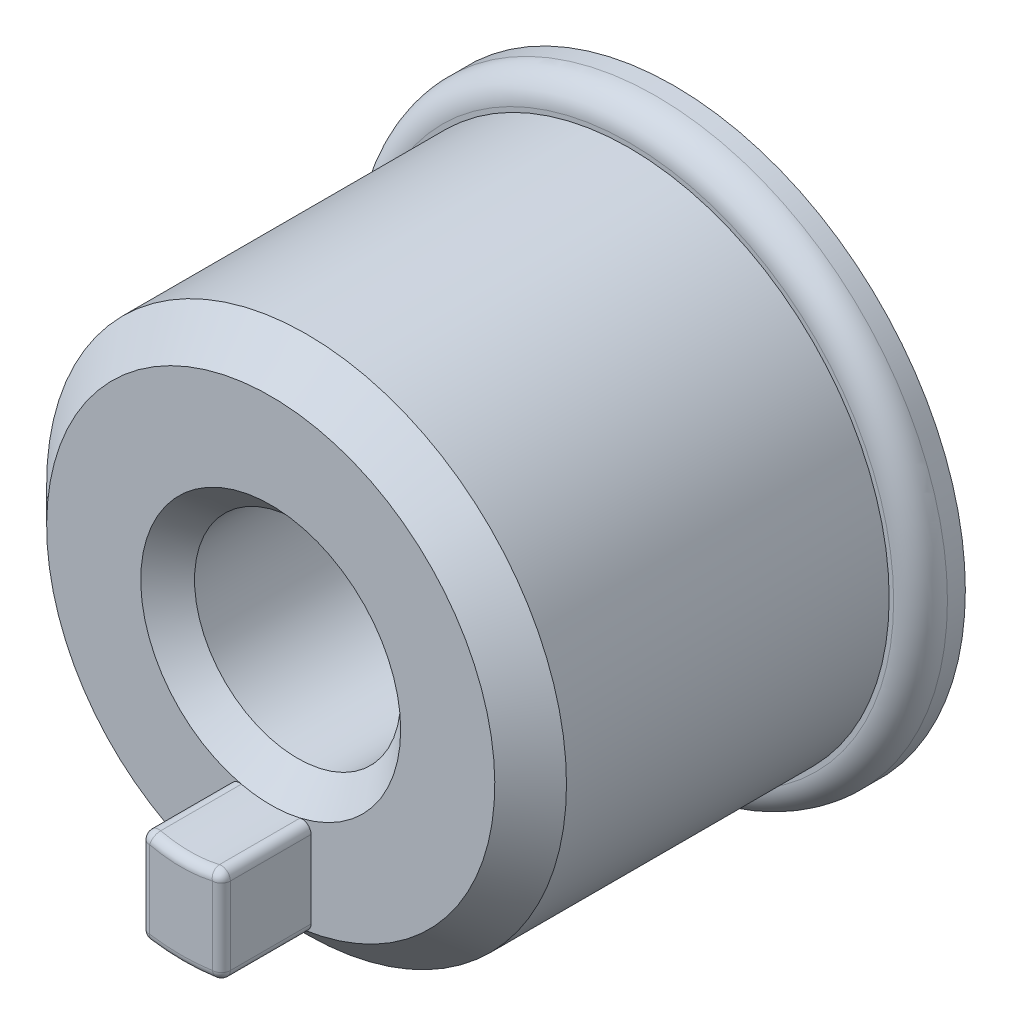
ISO-10303-21;
HEADER;
FILE_DESCRIPTION(('STEP AP214'),'2;1');
FILE_NAME('part.step','',(''),(''),'','','');
FILE_SCHEMA(('AUTOMOTIVE_DESIGN { 1 0 10303 214 1 1 1 1 }'));
ENDSEC;
DATA;
#1=APPLICATION_CONTEXT('core data for automotive mechanical design processes');
#2=APPLICATION_PROTOCOL_DEFINITION('international standard','automotive_design',2000,#1);
#3=PRODUCT_CONTEXT('',#1,'mechanical');
#4=PRODUCT('Part','Part','',(#3));
#5=PRODUCT_RELATED_PRODUCT_CATEGORY('part','',(#4));
#6=PRODUCT_DEFINITION_FORMATION('','',#4);
#7=PRODUCT_DEFINITION_CONTEXT('part definition',#1,'design');
#8=PRODUCT_DEFINITION('design','',#6,#7);
#9=PRODUCT_DEFINITION_SHAPE('','',#8);
#10=(LENGTH_UNIT() NAMED_UNIT(*) SI_UNIT(.MILLI.,.METRE.));
#11=(NAMED_UNIT(*) PLANE_ANGLE_UNIT() SI_UNIT($,.RADIAN.));
#12=(NAMED_UNIT(*) SI_UNIT($,.STERADIAN.) SOLID_ANGLE_UNIT());
#13=UNCERTAINTY_MEASURE_WITH_UNIT(LENGTH_MEASURE(1.E-05),#10,'distance_accuracy_value','');
#14=(GEOMETRIC_REPRESENTATION_CONTEXT(3) GLOBAL_UNCERTAINTY_ASSIGNED_CONTEXT((#13)) GLOBAL_UNIT_ASSIGNED_CONTEXT((#10,
#11,#12)) REPRESENTATION_CONTEXT('',''));
#15=CARTESIAN_POINT('',(0.,0.,0.));
#16=DIRECTION('',(0.,0.,1.));
#17=DIRECTION('',(1.,0.,0.));
#18=AXIS2_PLACEMENT_3D('',#15,#16,#17);
#19=CARTESIAN_POINT('',(0.,0.,20.8000000000001));
#20=DIRECTION('',(0.,0.,1.));
#21=DIRECTION('',(0.,-1.,0.));
#22=AXIS2_PLACEMENT_3D('',#19,#20,#21);
#23=TOROIDAL_SURFACE('',#22,1.55,0.0999999999999947);
#24=CARTESIAN_POINT('',(0.,0.,20.8));
#25=DIRECTION('',(0.,0.,1.));
#26=DIRECTION('',(1.,0.,0.));
#27=AXIS2_PLACEMENT_3D('',#24,#25,#26);
#28=CIRCLE('',#27,1.45);
#29=CARTESIAN_POINT('',(0.327419636650113,-1.41254960321328,20.8));
#30=VERTEX_POINT('',#29);
#31=CARTESIAN_POINT('',(-0.327419354938119,-1.41254966798112,20.8000000009568));
#32=VERTEX_POINT('',#31);
#33=EDGE_CURVE('E282',#30,#32,#28,.F.);
#34=ORIENTED_EDGE('',*,*,#33,.T.);
#35=CARTESIAN_POINT('',(-0.350000000000002,-1.50996688705401,20.8));
#36=DIRECTION('',(-0.974172186197778,0.225806447292016,4.43548605933242E-09));
#37=DIRECTION('',(-0.225806447292016,-0.974172186197778,0.));
#38=AXIS2_PLACEMENT_3D('',#35,#36,#37);
#39=CIRCLE('',#38,0.10000000000001);
#40=CARTESIAN_POINT('',(-0.334033072682872,-1.4410825112344,20.8707106781186));
#41=VERTEX_POINT('',#40);
#42=EDGE_CURVE('E288',#41,#32,#39,.T.);
#43=ORIENTED_EDGE('',*,*,#42,.F.);
#44=CARTESIAN_POINT('',(-0.35,-1.509966887054,20.8));
#45=DIRECTION('',(0.974172185196221,-0.225806451612925,0.));
#46=DIRECTION('',(0.225806451612925,0.974172185196221,0.));
#47=AXIS2_PLACEMENT_3D('',#44,#45,#46);
#48=CIRCLE('',#47,0.0999999999999947);
#49=CARTESIAN_POINT('',(-0.35000175073159,-1.50996550146103,20.8999999999962));
#50=VERTEX_POINT('',#49);
#51=EDGE_CURVE('E118',#50,#41,#48,.F.);
#52=ORIENTED_EDGE('',*,*,#51,.F.);
#53=CARTESIAN_POINT('',(0.,0.,20.8999999999999));
#54=DIRECTION('',(0.,0.,1.));
#55=DIRECTION('',(0.,-1.,0.));
#56=AXIS2_PLACEMENT_3D('',#53,#54,#55);
#57=CIRCLE('',#56,1.54999978998983);
#58=CARTESIAN_POINT('',(0.35000080590545,-1.50996542775249,20.9));
#59=VERTEX_POINT('',#58);
#60=EDGE_CURVE('E21',#59,#50,#57,.F.);
#61=ORIENTED_EDGE('',*,*,#60,.F.);
#62=CARTESIAN_POINT('',(0.334033072682876,-1.44108251123444,20.8707106781186));
#63=CARTESIAN_POINT('',(0.334279281209935,-1.44221300011488,20.8718676135226));
#64=CARTESIAN_POINT('',(0.334532857302521,-1.44337098318416,20.8729961099327));
#65=CARTESIAN_POINT('',(0.335054100880486,-1.44573904929684,20.8751936181666));
#66=CARTESIAN_POINT('',(0.335321768370766,-1.44694913235837,20.8762626299696));
#67=CARTESIAN_POINT('',(0.335870551023647,-1.44941851011635,20.8783385623005));
#68=CARTESIAN_POINT('',(0.336151666195553,-1.45067780484686,20.8793454827854));
#69=CARTESIAN_POINT('',(0.336726653266875,-1.453242566717,20.8812948137624));
#70=CARTESIAN_POINT('',(0.337020525179424,-1.45454803390418,20.882237224188));
#71=CARTESIAN_POINT('',(0.337620302334892,-1.45720200020952,20.884055261426));
#72=CARTESIAN_POINT('',(0.337926207594145,-1.4585504993861,20.8849308881478));
#73=CARTESIAN_POINT('',(0.338549293871298,-1.46128728416541,20.8866132479898));
#74=CARTESIAN_POINT('',(0.338866474908052,-1.46267556983466,20.8874199809949));
#75=CARTESIAN_POINT('',(0.339511323808161,-1.46548858791939,20.8889626086388));
#76=CARTESIAN_POINT('',(0.339838991692181,-1.46691332040668,20.8896985031382));
#77=CARTESIAN_POINT('',(0.340503995704106,-1.4697958054963,20.8910976798598));
#78=CARTESIAN_POINT('',(0.340841331853767,-1.47125355817293,20.8917609619188));
#79=CARTESIAN_POINT('',(0.341524826274506,-1.47419857852205,20.8930133147247));
#80=CARTESIAN_POINT('',(0.341870984567709,-1.47568584626857,20.8936023852854));
#81=CARTESIAN_POINT('',(0.342571251713924,-1.47868632152228,20.8947048948851));
#82=CARTESIAN_POINT('',(0.342925360588732,-1.4801995291006,20.8952183337166));
#83=CARTESIAN_POINT('',(0.34364063409754,-1.48324824728363,20.8961683417923));
#84=CARTESIAN_POINT('',(0.344001798752347,-1.48478375795412,20.8966049108097));
#85=CARTESIAN_POINT('',(0.34473026802162,-1.4878733928143,20.8974001266672));
#86=CARTESIAN_POINT('',(0.345097572655291,-1.4894275170622,20.8977587732634));
#87=CARTESIAN_POINT('',(0.345837387459362,-1.49255064571506,20.8983972784413));
#88=CARTESIAN_POINT('',(0.346209897646816,-1.49411965016876,20.8986771367646));
#89=CARTESIAN_POINT('',(0.346959172666669,-1.49726877080503,20.8991573931185));
#90=CARTESIAN_POINT('',(0.347335937513504,-1.49884888702528,20.8993577908792));
#91=CARTESIAN_POINT('',(0.34809275772006,-1.50201643743371,20.8996786314176));
#92=CARTESIAN_POINT('',(0.348472813091223,-1.50360387164732,20.8997990739171));
#93=CARTESIAN_POINT('',(0.349235236417101,-1.50678224552371,20.8999597536975));
#94=CARTESIAN_POINT('',(0.349617604379975,-1.50837318519886,20.8999999906954));
#95=CARTESIAN_POINT('',(0.350000638974054,-1.50996396845106,20.8999999999554));
#96=B_SPLINE_CURVE_WITH_KNOTS('',3,(#62,#63,#64,#65,#66,#67,#68,#69,#70,#71,#72,#73,#74,#75,#76,
#77,#78,#79,#80,#81,#82,#83,#84,#85,#86,#87,#88,#89,#90,#91,#92,#93,#94,#95),.UNSPECIFIED.,.F.,
.F.,(4,2,2,2,2,2,2,2,2,2,2,2,2,2,2,2,4),(0.,0.00490807707231481,0.00981615585109271,
0.0147242380263663,0.0196323252554527,0.024540419146996,0.0294485212454775,0.0343566330163377,
0.0392647558318674,0.0441728909579862,0.0490810395420567,0.0539892026018336,0.0588973810156651,
0.0638055755140326,0.0687137866725195,0.0736220149062689,0.0785302604659882),.UNSPECIFIED.);
#97=CARTESIAN_POINT('',(0.334033072682875,-1.44108251123445,20.8707106781187));
#98=VERTEX_POINT('',#97);
#99=EDGE_CURVE('E116',#98,#59,#96,.T.);
#100=ORIENTED_EDGE('',*,*,#99,.F.);
#101=CARTESIAN_POINT('',(0.35,-1.509966887054,20.8));
#102=DIRECTION('',(0.974173491601872,0.225800815381042,5.78565531320074E-06));
#103=DIRECTION('',(-0.225800815384821,0.974173491618177,0.));
#104=AXIS2_PLACEMENT_3D('',#101,#102,#103);
#105=CIRCLE('',#104,0.1);
#106=EDGE_CURVE('E132',#30,#98,#105,.T.);
#107=ORIENTED_EDGE('',*,*,#106,.F.);
#108=EDGE_LOOP('',(#34,#43,#52,#61,#100,#107));
#109=FACE_BOUND('',#108,.T.);
#110=ADVANCED_FACE('F17',(#109),#23,.T.);
#111=CARTESIAN_POINT('',(0.,0.,20.9));
#112=DIRECTION('',(0.,0.,1.));
#113=DIRECTION('',(1.,0.,0.));
#114=AXIS2_PLACEMENT_3D('',#111,#112,#113);
#115=PLANE('',#114);
#116=DIRECTION('',(0.,1.,0.));
#117=VECTOR('',#116,1.);
#118=CARTESIAN_POINT('',(0.3500016118109,0.,20.9));
#119=LINE('',#118,#117);
#120=CARTESIAN_POINT('',(0.350000782556116,-2.374341697321,20.8999999999999));
#121=VERTEX_POINT('',#120);
#122=EDGE_CURVE('E125',#59,#121,#119,.F.);
#123=ORIENTED_EDGE('',*,*,#122,.F.);
#124=ORIENTED_EDGE('',*,*,#60,.T.);
#125=DIRECTION('',(0.,-1.,0.));
#126=VECTOR('',#125,1.);
#127=CARTESIAN_POINT('',(-0.3500038850957,-1.32162217919,20.8999999999245));
#128=LINE('',#127,#126);
#129=CARTESIAN_POINT('',(-0.350003913236591,-2.37434168816603,20.8999999999802));
#130=VERTEX_POINT('',#129);
#131=EDGE_CURVE('E150',#130,#50,#128,.F.);
#132=ORIENTED_EDGE('',*,*,#131,.F.);
#133=CARTESIAN_POINT('',(0.,0.,20.9));
#134=DIRECTION('',(0.,0.,1.));
#135=DIRECTION('',(1.,0.,0.));
#136=AXIS2_PLACEMENT_3D('',#133,#134,#135);
#137=CIRCLE('',#136,2.39999992164737);
#138=EDGE_CURVE('E129',#121,#130,#137,.F.);
#139=ORIENTED_EDGE('',*,*,#138,.F.);
#140=EDGE_LOOP('',(#123,#124,#132,#139));
#141=FACE_BOUND('',#140,.T.);
#142=ADVANCED_FACE('F127',(#141),#115,.T.);
#143=CARTESIAN_POINT('',(-0.350000000000002,-2.37434201411699,20.8));
#144=DIRECTION('',(-0.103119738923043,-0.699547224599229,0.707106781186519));
#145=DIRECTION('',(0.112384997703179,0.69815006291624,0.707075739890223));
#146=AXIS2_PLACEMENT_3D('',#143,#144,#145);
#147=SPHERICAL_SURFACE('',#146,0.1);
#148=CARTESIAN_POINT('',(-0.350003857553364,-2.37434144547447,20.8));
#149=DIRECTION('',(0.98930893561436,-0.145834940647237,0.));
#150=DIRECTION('',(0.145834940647237,0.98930893561436,0.));
#151=AXIS2_PLACEMENT_3D('',#148,#149,#150);
#152=CIRCLE('',#151,0.0999999999999935);
#153=CARTESIAN_POINT('',(-0.360313959494719,-2.44429644386932,20.8707106781005));
#154=VERTEX_POINT('',#153);
#155=EDGE_CURVE('E268',#130,#154,#152,.T.);
#156=ORIENTED_EDGE('',*,*,#155,.F.);
#157=CARTESIAN_POINT('',(-0.35,-2.374342014117,20.8));
#158=DIRECTION('',(0.,-1.,0.));
#159=DIRECTION('',(0.,0.,-1.));
#160=AXIS2_PLACEMENT_3D('',#157,#158,#159);
#161=CIRCLE('',#160,0.0999999999999994);
#162=CARTESIAN_POINT('',(-0.448953322100637,-2.374342014117,20.8144305247729));
#163=VERTEX_POINT('',#162);
#164=EDGE_CURVE('E270',#163,#130,#161,.F.);
#165=ORIENTED_EDGE('',*,*,#164,.F.);
#166=CARTESIAN_POINT('',(-0.350000000000005,-2.374342014117,20.8));
#167=DIRECTION('',(-0.10311733743518,-0.6995475785987,-0.707106781184408));
#168=DIRECTION('',(0.,0.710896428835084,-0.703296713677467));
#169=AXIS2_PLACEMENT_3D('',#166,#167,#168);
#170=CIRCLE('',#169,0.0999999999999974);
#171=EDGE_CURVE('E273',#154,#163,#170,.T.);
#172=ORIENTED_EDGE('',*,*,#171,.F.);
#173=EDGE_LOOP('',(#156,#165,#172));
#174=FACE_BOUND('',#173,.T.);
#175=ADVANCED_FACE('F257',(#174),#147,.T.);
#176=CARTESIAN_POINT('',(0.,0.,15.4));
#177=DIRECTION('',(0.,0.,1.));
#178=DIRECTION('',(1.,0.,0.));
#179=AXIS2_PLACEMENT_3D('',#176,#177,#178);
#180=PLANE('',#179);
#181=CARTESIAN_POINT('',(0.,0.,15.4));
#182=DIRECTION('',(0.,0.,-1.));
#183=DIRECTION('',(-1.,0.,0.));
#184=AXIS2_PLACEMENT_3D('',#181,#182,#183);
#185=CIRCLE('',#184,3.25);
#186=CARTESIAN_POINT('',(-3.25,0.,15.4));
#187=VERTEX_POINT('',#186);
#188=EDGE_CURVE('E276',#187,#187,#185,.F.);
#189=ORIENTED_EDGE('',*,*,#188,.F.);
#190=EDGE_LOOP('',(#189));
#191=FACE_BOUND('',#190,.T.);
#192=CARTESIAN_POINT('',(0.,0.,15.4));
#193=DIRECTION('',(0.,0.,1.));
#194=DIRECTION('',(1.,0.,0.));
#195=AXIS2_PLACEMENT_3D('',#192,#193,#194);
#196=CIRCLE('',#195,1.15);
#197=CARTESIAN_POINT('',(1.15,0.,15.4));
#198=VERTEX_POINT('',#197);
#199=EDGE_CURVE('E141',#198,#198,#196,.T.);
#200=ORIENTED_EDGE('',*,*,#199,.T.);
#201=EDGE_LOOP('',(#200));
#202=FACE_BOUND('',#201,.T.);
#203=ADVANCED_FACE('F254',(#191,#202),#180,.F.);
#204=CARTESIAN_POINT('',(0.349999999999996,-2.374342014117,20.8));
#205=DIRECTION('',(0.103119738922969,-0.699547224599183,0.707106781186576));
#206=DIRECTION('',(-0.0937922759080953,0.70089044178563,0.70707538324674));
#207=AXIS2_PLACEMENT_3D('',#204,#205,#206);
#208=SPHERICAL_SURFACE('',#207,0.1);
#209=CARTESIAN_POINT('',(0.35,-2.374342014117,20.8));
#210=DIRECTION('',(0.,0.,-1.));
#211=DIRECTION('',(-1.,0.,0.));
#212=AXIS2_PLACEMENT_3D('',#209,#210,#211);
#213=CIRCLE('',#212,0.1);
#214=CARTESIAN_POINT('',(0.449999999999874,-2.374341855719,20.8));
#215=VERTEX_POINT('',#214);
#216=CARTESIAN_POINT('',(0.364583368377475,-2.47327292620591,20.8000000000005));
#217=VERTEX_POINT('',#216);
#218=EDGE_CURVE('E297',#215,#217,#213,.T.);
#219=ORIENTED_EDGE('',*,*,#218,.F.);
#220=CARTESIAN_POINT('',(0.35,-2.374341697321,20.8));
#221=DIRECTION('',(0.,1.,0.));
#222=DIRECTION('',(0.,0.,1.));
#223=AXIS2_PLACEMENT_3D('',#220,#221,#222);
#224=CIRCLE('',#223,0.0999999999999994);
#225=EDGE_CURVE('E122',#121,#215,#224,.T.);
#226=ORIENTED_EDGE('',*,*,#225,.F.);
#227=CARTESIAN_POINT('',(0.349999999999962,-2.37434201411677,20.8));
#228=DIRECTION('',(-0.98930917254865,-0.145833333333317,0.));
#229=DIRECTION('',(0.145833333333317,-0.98930917254865,0.));
#230=AXIS2_PLACEMENT_3D('',#227,#228,#229);
#231=CIRCLE('',#230,0.0999999999999934);
#232=CARTESIAN_POINT('',(0.360312008525872,-2.44429673147154,20.8707106781186));
#233=VERTEX_POINT('',#232);
#234=EDGE_CURVE('E382',#233,#121,#231,.T.);
#235=ORIENTED_EDGE('',*,*,#234,.F.);
#236=CARTESIAN_POINT('',(0.350000067284731,-2.37434200419837,20.8));
#237=DIRECTION('',(-0.989309168415983,-0.145833361368638,0.));
#238=DIRECTION('',(0.145833361368638,-0.989309168415983,0.));
#239=AXIS2_PLACEMENT_3D('',#236,#237,#238);
#240=CIRCLE('',#239,0.0999999999999934);
#241=EDGE_CURVE('E384',#217,#233,#240,.T.);
#242=ORIENTED_EDGE('',*,*,#241,.F.);
#243=EDGE_LOOP('',(#219,#226,#235,#242));
#244=FACE_BOUND('',#243,.T.);
#245=ADVANCED_FACE('F163',(#244),#208,.T.);
#246=CARTESIAN_POINT('',(0.35,-2.517065265568,20.8));
#247=DIRECTION('',(0.,1.,0.));
#248=DIRECTION('',(0.,0.,1.));
#249=AXIS2_PLACEMENT_3D('',#246,#247,#248);
#250=CYLINDRICAL_SURFACE('',#249,0.0999999999999994);
#251=CARTESIAN_POINT('',(0.35,-1.509966887054,20.8));
#252=DIRECTION('',(0.,1.,0.));
#253=DIRECTION('',(0.,0.,1.));
#254=AXIS2_PLACEMENT_3D('',#251,#252,#253);
#255=CIRCLE('',#254,0.0999999999999994);
#256=CARTESIAN_POINT('',(0.45,-1.509966887054,20.8));
#257=VERTEX_POINT('',#256);
#258=EDGE_CURVE('E135',#59,#257,#255,.T.);
#259=ORIENTED_EDGE('',*,*,#258,.F.);
#260=ORIENTED_EDGE('',*,*,#122,.T.);
#261=ORIENTED_EDGE('',*,*,#225,.T.);
#262=DIRECTION('',(0.,1.,0.));
#263=VECTOR('',#262,1.);
#264=CARTESIAN_POINT('',(0.45,-2.459166525472,20.8));
#265=LINE('',#264,#263);
#266=EDGE_CURVE('E138',#257,#215,#265,.F.);
#267=ORIENTED_EDGE('',*,*,#266,.F.);
#268=EDGE_LOOP('',(#259,#260,#261,#267));
#269=FACE_BOUND('',#268,.T.);
#270=ADVANCED_FACE('F136',(#269),#250,.T.);
#271=CARTESIAN_POINT('',(0.349999999999999,-1.509966887054,20.8));
#272=DIRECTION('',(-0.159669273171235,0.688843758195608,0.707106781186491));
#273=DIRECTION('',(0.150480961180038,-0.690941308815047,0.70707537653017));
#274=AXIS2_PLACEMENT_3D('',#271,#272,#273);
#275=SPHERICAL_SURFACE('',#274,0.0999999999999999);
#276=ORIENTED_EDGE('',*,*,#258,.T.);
#277=CARTESIAN_POINT('',(0.35,-1.509966887054,20.8));
#278=DIRECTION('',(0.,0.,-1.));
#279=DIRECTION('',(-1.,0.,0.));
#280=AXIS2_PLACEMENT_3D('',#277,#278,#279);
#281=CIRCLE('',#280,0.1);
#282=EDGE_CURVE('E302',#30,#257,#281,.T.);
#283=ORIENTED_EDGE('',*,*,#282,.F.);
#284=ORIENTED_EDGE('',*,*,#106,.T.);
#285=ORIENTED_EDGE('',*,*,#99,.T.);
#286=EDGE_LOOP('',(#276,#283,#284,#285));
#287=FACE_BOUND('',#286,.T.);
#288=ADVANCED_FACE('F143',(#287),#275,.T.);
#289=CARTESIAN_POINT('',(0.,0.,-0.325));
#290=DIRECTION('',(0.,0.,1.));
#291=DIRECTION('',(1.,0.,0.));
#292=AXIS2_PLACEMENT_3D('',#289,#290,#291);
#293=CYLINDRICAL_SURFACE('',#292,1.15);
#294=CARTESIAN_POINT('',(0.,0.,19.5999999999117));
#295=DIRECTION('',(0.,0.,1.));
#296=DIRECTION('',(1.,0.,0.));
#297=AXIS2_PLACEMENT_3D('',#294,#295,#296);
#298=CIRCLE('',#297,1.1499999999387);
#299=CARTESIAN_POINT('',(1.1499999999387,0.,19.5999999999117));
#300=VERTEX_POINT('',#299);
#301=EDGE_CURVE('E310',#300,#300,#298,.T.);
#302=ORIENTED_EDGE('',*,*,#301,.T.);
#303=EDGE_LOOP('',(#302));
#304=FACE_BOUND('',#303,.T.);
#305=ORIENTED_EDGE('',*,*,#199,.F.);
#306=EDGE_LOOP('',(#305));
#307=FACE_BOUND('',#306,.T.);
#308=ADVANCED_FACE('F162',(#304,#307),#293,.F.);
#309=CARTESIAN_POINT('',(-0.35,-1.509966887054,20.8));
#310=DIRECTION('',(0.159669273171181,0.688843758195547,0.707106781186563));
#311=DIRECTION('',(-0.159669270359824,-0.688843758847232,0.707106781186532));
#312=AXIS2_PLACEMENT_3D('',#309,#310,#311);
#313=SPHERICAL_SURFACE('',#312,0.100000000000001);
#314=ORIENTED_EDGE('',*,*,#42,.T.);
#315=CARTESIAN_POINT('',(-0.35,-1.509966887054,20.8));
#316=DIRECTION('',(0.,0.,-1.));
#317=DIRECTION('',(-1.,0.,0.));
#318=AXIS2_PLACEMENT_3D('',#315,#316,#317);
#319=CIRCLE('',#318,0.1);
#320=CARTESIAN_POINT('',(-0.449999999996576,-1.509966059522,20.8));
#321=VERTEX_POINT('',#320);
#322=EDGE_CURVE('E313',#321,#32,#319,.T.);
#323=ORIENTED_EDGE('',*,*,#322,.F.);
#324=CARTESIAN_POINT('',(-0.35,-1.50996523199,20.8));
#325=DIRECTION('',(0.,-1.,0.));
#326=DIRECTION('',(0.,0.,-1.));
#327=AXIS2_PLACEMENT_3D('',#324,#325,#326);
#328=CIRCLE('',#327,0.0999999999999994);
#329=EDGE_CURVE('E280',#50,#321,#328,.T.);
#330=ORIENTED_EDGE('',*,*,#329,.F.);
#331=ORIENTED_EDGE('',*,*,#51,.T.);
#332=EDGE_LOOP('',(#314,#323,#330,#331));
#333=FACE_BOUND('',#332,.T.);
#334=ADVANCED_FACE('F165',(#333),#313,.T.);
#335=CARTESIAN_POINT('',(0.,0.,19.9));
#336=DIRECTION('',(0.,0.,1.));
#337=DIRECTION('',(1.,0.,0.));
#338=AXIS2_PLACEMENT_3D('',#335,#336,#337);
#339=CYLINDRICAL_SURFACE('',#338,1.45);
#340=CARTESIAN_POINT('',(0.,0.,19.8999999999501));
#341=DIRECTION('',(0.,0.,1.));
#342=DIRECTION('',(1.,0.,0.));
#343=AXIS2_PLACEMENT_3D('',#340,#341,#342);
#344=CIRCLE('',#343,1.45000000003392);
#345=CARTESIAN_POINT('',(0.327419357968863,-1.41254966782632,19.8999999999753));
#346=VERTEX_POINT('',#345);
#347=CARTESIAN_POINT('',(-0.327419347907966,-1.41254967015836,19.8999999999626));
#348=VERTEX_POINT('',#347);
#349=EDGE_CURVE('E314',#346,#348,#344,.F.);
#350=ORIENTED_EDGE('',*,*,#349,.T.);
#351=DIRECTION('',(0.,0.,-1.));
#352=VECTOR('',#351,1.);
#353=CARTESIAN_POINT('',(-0.327419355037498,-1.4125496684883,20.95891989783));
#354=LINE('',#353,#352);
#355=EDGE_CURVE('E323',#32,#348,#354,.T.);
#356=ORIENTED_EDGE('',*,*,#355,.F.);
#357=ORIENTED_EDGE('',*,*,#33,.F.);
#358=DIRECTION('',(0.,0.,-1.));
#359=VECTOR('',#358,1.);
#360=CARTESIAN_POINT('',(0.327419361091325,-1.41254966708506,20.95891989783));
#361=LINE('',#360,#359);
#362=EDGE_CURVE('E332',#346,#30,#361,.F.);
#363=ORIENTED_EDGE('',*,*,#362,.F.);
#364=EDGE_LOOP('',(#350,#356,#357,#363));
#365=FACE_BOUND('',#364,.T.);
#366=ADVANCED_FACE('F167',(#365),#339,.F.);
#367=CARTESIAN_POINT('',(-0.35,-1.32162217919,20.8));
#368=DIRECTION('',(0.,-1.,0.));
#369=DIRECTION('',(0.,0.,-1.));
#370=AXIS2_PLACEMENT_3D('',#367,#368,#369);
#371=CYLINDRICAL_SURFACE('',#370,0.0999999999999994);
#372=ORIENTED_EDGE('',*,*,#164,.T.);
#373=ORIENTED_EDGE('',*,*,#131,.T.);
#374=ORIENTED_EDGE('',*,*,#329,.T.);
#375=DIRECTION('',(0.,1.,0.));
#376=VECTOR('',#375,1.);
#377=CARTESIAN_POINT('',(-0.45,-1.378404875209,20.8));
#378=LINE('',#377,#376);
#379=CARTESIAN_POINT('',(-0.45,-2.374342014117,20.8));
#380=VERTEX_POINT('',#379);
#381=EDGE_CURVE('E319',#380,#321,#378,.T.);
#382=ORIENTED_EDGE('',*,*,#381,.F.);
#383=CARTESIAN_POINT('',(-0.35,-2.374342014117,20.8));
#384=DIRECTION('',(0.,-1.,0.));
#385=DIRECTION('',(0.,0.,-1.));
#386=AXIS2_PLACEMENT_3D('',#383,#384,#385);
#387=CIRCLE('',#386,0.0999999999999994);
#388=EDGE_CURVE('E279',#163,#380,#387,.T.);
#389=ORIENTED_EDGE('',*,*,#388,.F.);
#390=EDGE_LOOP('',(#372,#373,#374,#382,#389));
#391=FACE_BOUND('',#390,.T.);
#392=ADVANCED_FACE('F182',(#391),#371,.T.);
#393=CARTESIAN_POINT('',(-0.3603119738923,-2.44429673657692,20.8707106781187));
#394=CARTESIAN_POINT('',(-0.3603119738923,-2.44429673657692,20.8707106781187));
#395=CARTESIAN_POINT('',(-0.3603119738923,-2.44429673657692,20.8707106781187));
#396=CARTESIAN_POINT('',(-0.3603119738923,-2.44429673657692,20.8707106781187));
#397=CARTESIAN_POINT('',(-0.3603119738923,-2.44429673657692,20.8707106781187));
#398=CARTESIAN_POINT('',(-0.360311973892299,-2.44429673657692,20.8707106781187));
#399=CARTESIAN_POINT('',(-0.360311973892299,-2.44429673657692,20.8707106781187));
#400=CARTESIAN_POINT('',(-0.413932327164052,-2.43584135297964,20.8712560318167));
#401=CARTESIAN_POINT('',(-0.413958837413264,-2.43602119411823,20.8710742472507));
#402=CARTESIAN_POINT('',(-0.413985347662477,-2.43620103525683,20.8708924626847));
#403=CARTESIAN_POINT('',(-0.414011857911689,-2.43638087639543,20.8707106781187));
#404=CARTESIAN_POINT('',(-0.41731526970835,-2.4587906747347,20.848058711513));
#405=CARTESIAN_POINT('',(-0.39712494837905,-2.47788088837646,20.8321170099118));
#406=CARTESIAN_POINT('',(-0.365402981719864,-2.48234120640965,20.8323304965069));
#407=CARTESIAN_POINT('',(-0.449829556472549,-2.40403496530154,20.84583150644));
#408=CARTESIAN_POINT('',(-0.449875676762175,-2.40434783770544,20.8455152530254));
#409=CARTESIAN_POINT('',(-0.449921797051801,-2.40466071010933,20.8451989996108));
#410=CARTESIAN_POINT('',(-0.449967917341427,-2.40497358251322,20.8448827461962));
#411=CARTESIAN_POINT('',(-0.455714913817982,-2.44396025448256,20.805474770357));
#412=CARTESIAN_POINT('',(-0.420589500250925,-2.47717179373019,20.77774074609));
#413=CARTESIAN_POINT('',(-0.365402305362294,-2.4849314778383,20.7781121520137));
#414=CARTESIAN_POINT('',(-0.449316672077404,-2.36543499737921,20.8076723252638));
#415=CARTESIAN_POINT('',(-0.449365293816798,-2.36576483920391,20.8073389190508));
#416=CARTESIAN_POINT('',(-0.449413915556192,-2.3660946810286,20.8070055128378));
#417=CARTESIAN_POINT('',(-0.449462537295586,-2.36642452285329,20.8066721066248));
#418=CARTESIAN_POINT('',(-0.455521236563283,-2.40752573491671,20.7651267402178));
#419=CARTESIAN_POINT('',(-0.418490707951611,-2.44253858542733,20.7358884914731));
#420=CARTESIAN_POINT('',(-0.360310296910468,-2.45071913549642,20.7362800415301));
#421=(BOUNDED_SURFACE() B_SPLINE_SURFACE(3,3,((#393,#394,#395,#396,#397,#398,#399),(#400,#401,
#402,#403,#404,#405,#406),(#407,#408,#409,#410,#411,#412,#413),(#414,#415,#416,#417,#418,#419,
#420)),.UNSPECIFIED.,.F.,.F.,.F.) B_SPLINE_SURFACE_WITH_KNOTS((4,4),(4,3,4),(0.,1.),(-0.01,0.,
1.),.UNSPECIFIED.) GEOMETRIC_REPRESENTATION_ITEM() RATIONAL_B_SPLINE_SURFACE(((1.,1.,1.,1.,
0.802511186738431,0.802511186738431,1.),(0.826476953789444,0.826476953789444,0.826476953789444,
0.826476953789444,0.66325700099753,0.66325700099753,0.826476953789444),(0.826476953789444,
0.826476953789444,0.826476953789444,0.826476953789444,0.66325700099753,0.66325700099753,
0.826476953789444),(1.,1.,1.,1.,0.802511186738431,0.802511186738431,1.))) REPRESENTATION_ITEM('') SURFACE());
#422=CARTESIAN_POINT('',(-0.35,-2.374342014117,20.8));
#423=DIRECTION('',(0.,0.,-1.));
#424=DIRECTION('',(-1.,0.,0.));
#425=AXIS2_PLACEMENT_3D('',#422,#423,#424);
#426=CIRCLE('',#425,0.1);
#427=CARTESIAN_POINT('',(-0.364583333333289,-2.47327293137175,20.8000000000005));
#428=VERTEX_POINT('',#427);
#429=EDGE_CURVE('E342',#428,#380,#426,.T.);
#430=CARTESIAN_POINT('',(-0.349999999999963,-2.37434201411677,20.8));
#431=DIRECTION('',(-0.989309172548649,0.145833333333317,0.));
#432=DIRECTION('',(-0.145833333333317,-0.989309172548649,0.));
#433=AXIS2_PLACEMENT_3D('',#430,#431,#432);
#434=CIRCLE('',#433,0.0999999999999934);
#435=EDGE_CURVE('E386',#154,#428,#434,.F.);
#436=ORIENTED_EDGE('',*,*,#388,.T.);
#437=ORIENTED_EDGE('',*,*,#429,.F.);
#438=ORIENTED_EDGE('',*,*,#435,.F.);
#439=ORIENTED_EDGE('',*,*,#171,.T.);
#440=EDGE_LOOP('',(#436,#437,#438,#439));
#441=FACE_BOUND('',#440,.T.);
#442=ADVANCED_FACE('F172',(#441),#421,.T.);
#443=CARTESIAN_POINT('',(0.,0.,20.8));
#444=DIRECTION('',(0.,0.,1.));
#445=DIRECTION('',(1.,0.,0.));
#446=AXIS2_PLACEMENT_3D('',#443,#444,#445);
#447=TOROIDAL_SURFACE('',#446,2.40000000000001,0.0999999999999934);
#448=ORIENTED_EDGE('',*,*,#138,.T.);
#449=ORIENTED_EDGE('',*,*,#155,.T.);
#450=ORIENTED_EDGE('',*,*,#435,.T.);
#451=CARTESIAN_POINT('',(0.,0.,20.800000000001));
#452=DIRECTION('',(0.,0.,1.));
#453=DIRECTION('',(1.,0.,0.));
#454=AXIS2_PLACEMENT_3D('',#451,#452,#453);
#455=CIRCLE('',#454,2.5);
#456=EDGE_CURVE('E324',#217,#428,#455,.F.);
#457=ORIENTED_EDGE('',*,*,#456,.F.);
#458=ORIENTED_EDGE('',*,*,#241,.T.);
#459=ORIENTED_EDGE('',*,*,#234,.T.);
#460=EDGE_LOOP('',(#448,#449,#450,#457,#458,#459));
#461=FACE_BOUND('',#460,.T.);
#462=ADVANCED_FACE('F169',(#461),#447,.T.);
#463=CARTESIAN_POINT('',(0.,0.,20.895));
#464=DIRECTION('',(0.,0.,-1.));
#465=DIRECTION('',(-1.,0.,0.));
#466=AXIS2_PLACEMENT_3D('',#463,#464,#465);
#467=CYLINDRICAL_SURFACE('',#466,3.25);
#468=CARTESIAN_POINT('',(0.,0.,15.6));
#469=DIRECTION('',(0.,0.,1.));
#470=DIRECTION('',(1.,0.,0.));
#471=AXIS2_PLACEMENT_3D('',#468,#469,#470);
#472=CIRCLE('',#471,3.25);
#473=CARTESIAN_POINT('',(3.25,0.,15.6));
#474=VERTEX_POINT('',#473);
#475=EDGE_CURVE('E329',#474,#474,#472,.T.);
#476=ORIENTED_EDGE('',*,*,#475,.F.);
#477=EDGE_LOOP('',(#476));
#478=FACE_BOUND('',#477,.T.);
#479=ORIENTED_EDGE('',*,*,#188,.T.);
#480=EDGE_LOOP('',(#479));
#481=FACE_BOUND('',#480,.T.);
#482=ADVANCED_FACE('F171',(#478,#481),#467,.T.);
#483=CARTESIAN_POINT('',(0.35,-2.374342014117,20.95891989783));
#484=DIRECTION('',(0.,0.,-1.));
#485=DIRECTION('',(-1.,0.,0.));
#486=AXIS2_PLACEMENT_3D('',#483,#484,#485);
#487=CYLINDRICAL_SURFACE('',#486,0.1);
#488=CARTESIAN_POINT('',(0.35,-2.374342014117,19.8999999999761));
#489=DIRECTION('',(0.,0.,-1.));
#490=DIRECTION('',(-1.,0.,0.));
#491=AXIS2_PLACEMENT_3D('',#488,#489,#490);
#492=CIRCLE('',#491,0.1);
#493=CARTESIAN_POINT('',(0.364583368377309,-2.47327292620479,19.8999999999636));
#494=VERTEX_POINT('',#493);
#495=CARTESIAN_POINT('',(0.45,-2.374341934918,19.899999999988));
#496=VERTEX_POINT('',#495);
#497=EDGE_CURVE('E300',#494,#496,#492,.F.);
#498=ORIENTED_EDGE('',*,*,#497,.T.);
#499=DIRECTION('',(0.,0.,-1.));
#500=VECTOR('',#499,1.);
#501=CARTESIAN_POINT('',(0.45,-2.374341855719,19.9));
#502=LINE('',#501,#500);
#503=EDGE_CURVE('E295',#215,#496,#502,.T.);
#504=ORIENTED_EDGE('',*,*,#503,.F.);
#505=ORIENTED_EDGE('',*,*,#218,.T.);
#506=DIRECTION('',(0.,0.,1.));
#507=VECTOR('',#506,1.);
#508=CARTESIAN_POINT('',(0.364583403421618,-2.47327292103995,19.9));
#509=LINE('',#508,#507);
#510=EDGE_CURVE('E328',#494,#217,#509,.T.);
#511=ORIENTED_EDGE('',*,*,#510,.F.);
#512=EDGE_LOOP('',(#498,#504,#505,#511));
#513=FACE_BOUND('',#512,.T.);
#514=ADVANCED_FACE('F179',(#513),#487,.T.);
#515=CARTESIAN_POINT('',(0.45,-2.459166525472,19.9));
#516=DIRECTION('',(1.,0.,0.));
#517=DIRECTION('',(0.,0.,-1.));
#518=AXIS2_PLACEMENT_3D('',#515,#516,#517);
#519=PLANE('',#518);
#520=ORIENTED_EDGE('',*,*,#503,.T.);
#521=DIRECTION('',(0.,1.,0.));
#522=VECTOR('',#521,1.);
#523=CARTESIAN_POINT('',(0.45,0.,19.9));
#524=LINE('',#523,#522);
#525=CARTESIAN_POINT('',(0.45,-1.509966887054,19.9));
#526=VERTEX_POINT('',#525);
#527=EDGE_CURVE('E352',#496,#526,#524,.T.);
#528=ORIENTED_EDGE('',*,*,#527,.T.);
#529=DIRECTION('',(0.,0.,-1.));
#530=VECTOR('',#529,1.);
#531=CARTESIAN_POINT('',(0.45,-1.509966887054,20.95891989783));
#532=LINE('',#531,#530);
#533=EDGE_CURVE('E305',#257,#526,#532,.T.);
#534=ORIENTED_EDGE('',*,*,#533,.F.);
#535=ORIENTED_EDGE('',*,*,#266,.T.);
#536=EDGE_LOOP('',(#520,#528,#534,#535));
#537=FACE_BOUND('',#536,.T.);
#538=ADVANCED_FACE('F228',(#537),#519,.T.);
#539=CARTESIAN_POINT('',(0.35,-1.509966887054,20.95891989783));
#540=DIRECTION('',(0.,0.,-1.));
#541=DIRECTION('',(-1.,0.,0.));
#542=AXIS2_PLACEMENT_3D('',#539,#540,#541);
#543=CYLINDRICAL_SURFACE('',#542,0.1);
#544=CARTESIAN_POINT('',(0.35,-1.509966887054,19.9));
#545=DIRECTION('',(0.,0.,-1.));
#546=DIRECTION('',(-1.,0.,0.));
#547=AXIS2_PLACEMENT_3D('',#544,#545,#546);
#548=CIRCLE('',#547,0.1);
#549=EDGE_CURVE('E354',#526,#346,#548,.F.);
#550=ORIENTED_EDGE('',*,*,#549,.T.);
#551=ORIENTED_EDGE('',*,*,#362,.T.);
#552=ORIENTED_EDGE('',*,*,#282,.T.);
#553=ORIENTED_EDGE('',*,*,#533,.T.);
#554=EDGE_LOOP('',(#550,#551,#552,#553));
#555=FACE_BOUND('',#554,.T.);
#556=ADVANCED_FACE('F224',(#555),#543,.T.);
#557=CARTESIAN_POINT('',(0.,0.,19.9000000000069));
#558=DIRECTION('',(0.,0.,1.));
#559=DIRECTION('',(1.,0.,0.));
#560=AXIS2_PLACEMENT_3D('',#557,#558,#559);
#561=CONICAL_SURFACE('',#560,1.45000000009077,0.785398163492187);
#562=ORIENTED_EDGE('',*,*,#349,.F.);
#563=CARTESIAN_POINT('',(0.,0.,19.8999999999501));
#564=DIRECTION('',(0.,0.,1.));
#565=DIRECTION('',(1.,0.,0.));
#566=AXIS2_PLACEMENT_3D('',#563,#564,#565);
#567=CIRCLE('',#566,1.45000000003392);
#568=EDGE_CURVE('E362',#346,#348,#567,.T.);
#569=ORIENTED_EDGE('',*,*,#568,.T.);
#570=EDGE_LOOP('',(#562,#569));
#571=FACE_BOUND('',#570,.T.);
#572=ORIENTED_EDGE('',*,*,#301,.F.);
#573=EDGE_LOOP('',(#572));
#574=FACE_BOUND('',#573,.T.);
#575=ADVANCED_FACE('F220',(#571,#574),#561,.F.);
#576=CARTESIAN_POINT('',(-0.35,-1.509966887054,20.95891989783));
#577=DIRECTION('',(0.,0.,-1.));
#578=DIRECTION('',(-1.,0.,0.));
#579=AXIS2_PLACEMENT_3D('',#576,#577,#578);
#580=CYLINDRICAL_SURFACE('',#579,0.1);
#581=CARTESIAN_POINT('',(-0.35,-1.509966887054,19.899999999975));
#582=DIRECTION('',(0.,0.,-1.));
#583=DIRECTION('',(-1.,0.,0.));
#584=AXIS2_PLACEMENT_3D('',#581,#582,#583);
#585=CIRCLE('',#584,0.1);
#586=CARTESIAN_POINT('',(-0.45,-1.509966473288,19.8999999999875));
#587=VERTEX_POINT('',#586);
#588=EDGE_CURVE('E356',#348,#587,#585,.F.);
#589=ORIENTED_EDGE('',*,*,#588,.T.);
#590=DIRECTION('',(0.,0.,1.));
#591=VECTOR('',#590,1.);
#592=CARTESIAN_POINT('',(-0.45,-1.509966059522,19.9));
#593=LINE('',#592,#591);
#594=EDGE_CURVE('E322',#321,#587,#593,.F.);
#595=ORIENTED_EDGE('',*,*,#594,.F.);
#596=ORIENTED_EDGE('',*,*,#322,.T.);
#597=ORIENTED_EDGE('',*,*,#355,.T.);
#598=EDGE_LOOP('',(#589,#595,#596,#597));
#599=FACE_BOUND('',#598,.T.);
#600=ADVANCED_FACE('F216',(#599),#580,.T.);
#601=CARTESIAN_POINT('',(-0.45,-1.378404875209,19.9));
#602=DIRECTION('',(-1.,0.,0.));
#603=DIRECTION('',(0.,0.,1.));
#604=AXIS2_PLACEMENT_3D('',#601,#602,#603);
#605=PLANE('',#604);
#606=ORIENTED_EDGE('',*,*,#594,.T.);
#607=DIRECTION('',(0.,1.,0.));
#608=VECTOR('',#607,1.);
#609=CARTESIAN_POINT('',(-0.45,0.,19.9));
#610=LINE('',#609,#608);
#611=CARTESIAN_POINT('',(-0.45,-2.374342014117,19.9));
#612=VERTEX_POINT('',#611);
#613=EDGE_CURVE('E355',#587,#612,#610,.F.);
#614=ORIENTED_EDGE('',*,*,#613,.T.);
#615=DIRECTION('',(0.,0.,-1.));
#616=VECTOR('',#615,1.);
#617=CARTESIAN_POINT('',(-0.45,-2.374342014117,20.95891989783));
#618=LINE('',#617,#616);
#619=EDGE_CURVE('E339',#380,#612,#618,.T.);
#620=ORIENTED_EDGE('',*,*,#619,.F.);
#621=ORIENTED_EDGE('',*,*,#381,.T.);
#622=EDGE_LOOP('',(#606,#614,#620,#621));
#623=FACE_BOUND('',#622,.T.);
#624=ADVANCED_FACE('F212',(#623),#605,.T.);
#625=CARTESIAN_POINT('',(-0.35,-2.374342014117,20.95891989783));
#626=DIRECTION('',(0.,0.,-1.));
#627=DIRECTION('',(-1.,0.,0.));
#628=AXIS2_PLACEMENT_3D('',#625,#626,#627);
#629=CYLINDRICAL_SURFACE('',#628,0.1);
#630=CARTESIAN_POINT('',(-0.35,-2.374342014117,19.9));
#631=DIRECTION('',(0.,0.,-1.));
#632=DIRECTION('',(-1.,0.,0.));
#633=AXIS2_PLACEMENT_3D('',#630,#631,#632);
#634=CIRCLE('',#633,0.1);
#635=CARTESIAN_POINT('',(-0.364583368403193,-2.47327292620085,19.899999999975));
#636=VERTEX_POINT('',#635);
#637=EDGE_CURVE('E351',#612,#636,#634,.F.);
#638=ORIENTED_EDGE('',*,*,#637,.T.);
#639=DIRECTION('',(0.,0.,1.));
#640=VECTOR('',#639,1.);
#641=CARTESIAN_POINT('',(-0.364583333333245,-2.47327293137163,19.9));
#642=LINE('',#641,#640);
#643=EDGE_CURVE('E327',#428,#636,#642,.F.);
#644=ORIENTED_EDGE('',*,*,#643,.F.);
#645=ORIENTED_EDGE('',*,*,#429,.T.);
#646=ORIENTED_EDGE('',*,*,#619,.T.);
#647=EDGE_LOOP('',(#638,#644,#645,#646));
#648=FACE_BOUND('',#647,.T.);
#649=ADVANCED_FACE('F208',(#648),#629,.T.);
#650=CARTESIAN_POINT('',(0.,0.,19.9));
#651=DIRECTION('',(0.,0.,1.));
#652=DIRECTION('',(1.,0.,0.));
#653=AXIS2_PLACEMENT_3D('',#650,#651,#652);
#654=CYLINDRICAL_SURFACE('',#653,2.5);
#655=ORIENTED_EDGE('',*,*,#643,.T.);
#656=CARTESIAN_POINT('',(0.,0.,19.8999999999501));
#657=DIRECTION('',(0.,0.,-1.));
#658=DIRECTION('',(-1.,0.,0.));
#659=AXIS2_PLACEMENT_3D('',#656,#657,#658);
#660=CIRCLE('',#659,2.49999999999773);
#661=EDGE_CURVE('E347',#494,#636,#660,.T.);
#662=ORIENTED_EDGE('',*,*,#661,.F.);
#663=ORIENTED_EDGE('',*,*,#510,.T.);
#664=ORIENTED_EDGE('',*,*,#456,.T.);
#665=EDGE_LOOP('',(#655,#662,#663,#664));
#666=FACE_BOUND('',#665,.T.);
#667=ADVANCED_FACE('F205',(#666),#654,.T.);
#668=CARTESIAN_POINT('',(0.,0.,15.6));
#669=DIRECTION('',(0.,0.,-1.));
#670=DIRECTION('',(-1.,0.,0.));
#671=AXIS2_PLACEMENT_3D('',#668,#669,#670);
#672=TOROIDAL_SURFACE('',#671,2.95,0.3);
#673=DIRECTION('',(0.999923774119058,-0.0123469004814992,0.));
#674=VECTOR('',#673,1.);
#675=CARTESIAN_POINT('',(-0.0732834011954851,-2.94909473557262,15.9));
#676=LINE('',#675,#674);
#677=CARTESIAN_POINT('',(-0.0732833352691667,-2.94909208254531,15.8999999999781));
#678=VERTEX_POINT('',#677);
#679=CARTESIAN_POINT('',(0.,-2.9499996274103,15.8999999999998));
#680=VERTEX_POINT('',#679);
#681=EDGE_CURVE('E350',#678,#680,#676,.T.);
#682=ORIENTED_EDGE('',*,*,#681,.F.);
#683=CARTESIAN_POINT('',(0.,0.,15.8999999999902));
#684=DIRECTION('',(0.,0.,-1.));
#685=DIRECTION('',(-1.,0.,0.));
#686=AXIS2_PLACEMENT_3D('',#683,#684,#685);
#687=CIRCLE('',#686,2.95000242723652);
#688=EDGE_CURVE('E35',#680,#678,#687,.F.);
#689=ORIENTED_EDGE('',*,*,#688,.F.);
#690=EDGE_LOOP('',(#682,#689));
#691=FACE_BOUND('',#690,.T.);
#692=ORIENTED_EDGE('',*,*,#475,.T.);
#693=EDGE_LOOP('',(#692));
#694=FACE_BOUND('',#693,.T.);
#695=ADVANCED_FACE('F19',(#691,#694),#672,.T.);
#696=CARTESIAN_POINT('',(0.,0.,19.9));
#697=DIRECTION('',(0.,0.,-1.));
#698=DIRECTION('',(-1.,0.,0.));
#699=AXIS2_PLACEMENT_3D('',#696,#697,#698);
#700=PLANE('',#699);
#701=ORIENTED_EDGE('',*,*,#613,.F.);
#702=ORIENTED_EDGE('',*,*,#588,.F.);
#703=ORIENTED_EDGE('',*,*,#568,.F.);
#704=ORIENTED_EDGE('',*,*,#549,.F.);
#705=ORIENTED_EDGE('',*,*,#527,.F.);
#706=ORIENTED_EDGE('',*,*,#497,.F.);
#707=CARTESIAN_POINT('',(0.,0.,19.8999999999501));
#708=DIRECTION('',(0.,0.,-1.));
#709=DIRECTION('',(-1.,0.,0.));
#710=AXIS2_PLACEMENT_3D('',#707,#708,#709);
#711=CIRCLE('',#710,2.49999999999773);
#712=EDGE_CURVE('E528',#636,#494,#711,.T.);
#713=ORIENTED_EDGE('',*,*,#712,.F.);
#714=ORIENTED_EDGE('',*,*,#637,.F.);
#715=EDGE_LOOP('',(#701,#702,#703,#704,#705,#706,#713,#714));
#716=FACE_BOUND('',#715,.T.);
#717=ADVANCED_FACE('F200',(#716),#700,.F.);
#718=CARTESIAN_POINT('',(0.,0.,15.9));
#719=DIRECTION('',(0.,0.,1.));
#720=DIRECTION('',(1.,0.,0.));
#721=AXIS2_PLACEMENT_3D('',#718,#719,#720);
#722=PLANE('',#721);
#723=ORIENTED_EDGE('',*,*,#688,.T.);
#724=ORIENTED_EDGE('',*,*,#681,.T.);
#725=EDGE_LOOP('',(#723,#724));
#726=FACE_BOUND('',#725,.T.);
#727=CARTESIAN_POINT('',(0.,0.,15.9));
#728=DIRECTION('',(0.,0.,1.));
#729=DIRECTION('',(1.,0.,0.));
#730=AXIS2_PLACEMENT_3D('',#727,#728,#729);
#731=CIRCLE('',#730,2.9);
#732=CARTESIAN_POINT('',(2.9,0.,15.9));
#733=VERTEX_POINT('',#732);
#734=EDGE_CURVE('E27',#733,#733,#731,.T.);
#735=ORIENTED_EDGE('',*,*,#734,.F.);
#736=EDGE_LOOP('',(#735));
#737=FACE_BOUND('',#736,.T.);
#738=ADVANCED_FACE('F193',(#726,#737),#722,.T.);
#739=CARTESIAN_POINT('',(0.,0.,19.5000000000505));
#740=DIRECTION('',(0.,0.,-1.));
#741=DIRECTION('',(-1.,0.,0.));
#742=AXIS2_PLACEMENT_3D('',#739,#740,#741);
#743=CONICAL_SURFACE('',#742,2.89999999989732,0.785398163397448);
#744=CARTESIAN_POINT('',(0.,0.,19.5));
#745=DIRECTION('',(0.,0.,1.));
#746=DIRECTION('',(1.,0.,0.));
#747=AXIS2_PLACEMENT_3D('',#744,#745,#746);
#748=CIRCLE('',#747,2.9);
#749=CARTESIAN_POINT('',(2.9,0.,19.5));
#750=VERTEX_POINT('',#749);
#751=EDGE_CURVE('E11',#750,#750,#748,.F.);
#752=ORIENTED_EDGE('',*,*,#751,.F.);
#753=EDGE_LOOP('',(#752));
#754=FACE_BOUND('',#753,.T.);
#755=ORIENTED_EDGE('',*,*,#712,.T.);
#756=ORIENTED_EDGE('',*,*,#661,.T.);
#757=EDGE_LOOP('',(#755,#756));
#758=FACE_BOUND('',#757,.T.);
#759=ADVANCED_FACE('F187',(#754,#758),#743,.T.);
#760=CARTESIAN_POINT('',(0.,0.,19.9));
#761=DIRECTION('',(0.,0.,1.));
#762=DIRECTION('',(1.,0.,0.));
#763=AXIS2_PLACEMENT_3D('',#760,#761,#762);
#764=CYLINDRICAL_SURFACE('',#763,2.9);
#765=ORIENTED_EDGE('',*,*,#751,.T.);
#766=EDGE_LOOP('',(#765));
#767=FACE_BOUND('',#766,.T.);
#768=ORIENTED_EDGE('',*,*,#734,.T.);
#769=EDGE_LOOP('',(#768));
#770=FACE_BOUND('',#769,.T.);
#771=ADVANCED_FACE('F185',(#767,#770),#764,.T.);
#772=CLOSED_SHELL('',(#110,#142,#175,#203,#245,#270,#288,#308,#334,#366,#392,#442,#462,#482,
#514,#538,#556,#575,#600,#624,#649,#667,#695,#717,#738,#759,#771));
#773=MANIFOLD_SOLID_BREP('B1',#772);
#774=ADVANCED_BREP_SHAPE_REPRESENTATION('',(#18,#773),#14);
#775=SHAPE_DEFINITION_REPRESENTATION(#9,#774);
ENDSEC;
END-ISO-10303-21;
